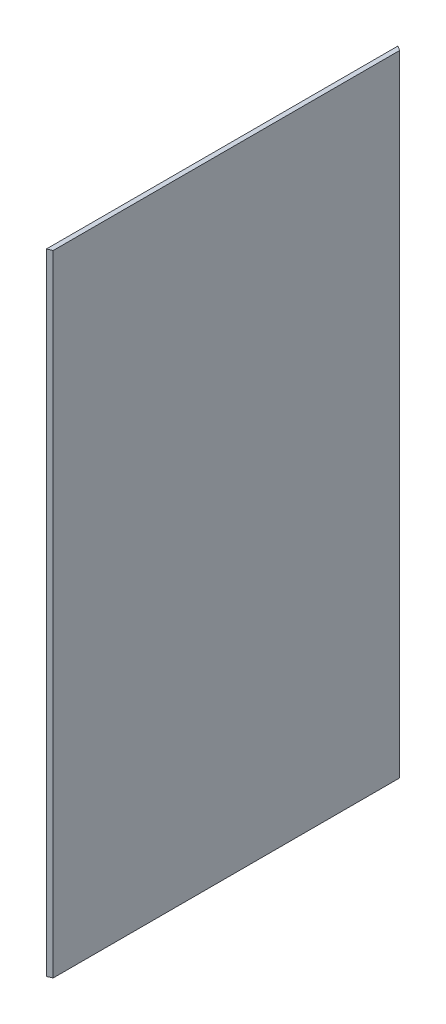
ISO-10303-21;
HEADER;
FILE_DESCRIPTION(('STEP AP214'),'2;1');
FILE_NAME('part.step','',(''),(''),'','','');
FILE_SCHEMA(('AUTOMOTIVE_DESIGN { 1 0 10303 214 1 1 1 1 }'));
ENDSEC;
DATA;
#1=APPLICATION_CONTEXT('core data for automotive mechanical design processes');
#2=APPLICATION_PROTOCOL_DEFINITION('international standard','automotive_design',2000,#1);
#3=PRODUCT_CONTEXT('',#1,'mechanical');
#4=PRODUCT('Part','Part','',(#3));
#5=PRODUCT_RELATED_PRODUCT_CATEGORY('part','',(#4));
#6=PRODUCT_DEFINITION_FORMATION('','',#4);
#7=PRODUCT_DEFINITION_CONTEXT('part definition',#1,'design');
#8=PRODUCT_DEFINITION('design','',#6,#7);
#9=PRODUCT_DEFINITION_SHAPE('','',#8);
#10=(LENGTH_UNIT() NAMED_UNIT(*) SI_UNIT(.MILLI.,.METRE.));
#11=(NAMED_UNIT(*) PLANE_ANGLE_UNIT() SI_UNIT($,.RADIAN.));
#12=(NAMED_UNIT(*) SI_UNIT($,.STERADIAN.) SOLID_ANGLE_UNIT());
#13=UNCERTAINTY_MEASURE_WITH_UNIT(LENGTH_MEASURE(1.E-05),#10,'distance_accuracy_value','');
#14=(GEOMETRIC_REPRESENTATION_CONTEXT(3) GLOBAL_UNCERTAINTY_ASSIGNED_CONTEXT((#13)) GLOBAL_UNIT_ASSIGNED_CONTEXT((#10,
#11,#12)) REPRESENTATION_CONTEXT('',''));
#15=CARTESIAN_POINT('',(0.,0.,0.));
#16=DIRECTION('',(0.,0.,1.));
#17=DIRECTION('',(1.,0.,0.));
#18=AXIS2_PLACEMENT_3D('',#15,#16,#17);
#19=CARTESIAN_POINT('',(0.,533.,0.));
#20=DIRECTION('',(1.,0.,0.));
#21=DIRECTION('',(0.,0.,-1.));
#22=AXIS2_PLACEMENT_3D('',#19,#20,#21);
#23=PLANE('',#22);
#24=DIRECTION('',(0.,0.,1.));
#25=VECTOR('',#24,1.);
#26=CARTESIAN_POINT('',(0.,0.,0.));
#27=LINE('',#26,#25);
#28=CARTESIAN_POINT('',(0.,0.,-297.387590837121));
#29=VERTEX_POINT('',#28);
#30=CARTESIAN_POINT('',(0.,0.,0.));
#31=VERTEX_POINT('',#30);
#32=EDGE_CURVE('E96',#29,#31,#27,.T.);
#33=ORIENTED_EDGE('',*,*,#32,.T.);
#34=DIRECTION('',(0.,-1.,0.));
#35=VECTOR('',#34,1.);
#36=CARTESIAN_POINT('',(0.,533.,0.));
#37=LINE('',#36,#35);
#38=CARTESIAN_POINT('',(0.,533.,0.));
#39=VERTEX_POINT('',#38);
#40=EDGE_CURVE('E11',#39,#31,#37,.T.);
#41=ORIENTED_EDGE('',*,*,#40,.F.);
#42=DIRECTION('',(0.,0.,1.));
#43=VECTOR('',#42,1.);
#44=CARTESIAN_POINT('',(0.,533.,0.));
#45=LINE('',#44,#43);
#46=CARTESIAN_POINT('',(0.,533.,-297.387590837121));
#47=VERTEX_POINT('',#46);
#48=EDGE_CURVE('E84',#47,#39,#45,.T.);
#49=ORIENTED_EDGE('',*,*,#48,.F.);
#50=DIRECTION('',(0.,-1.,0.));
#51=VECTOR('',#50,1.);
#52=CARTESIAN_POINT('',(0.,533.,-297.387590837121));
#53=LINE('',#52,#51);
#54=EDGE_CURVE('E92',#47,#29,#53,.T.);
#55=ORIENTED_EDGE('',*,*,#54,.T.);
#56=EDGE_LOOP('',(#33,#41,#49,#55));
#57=FACE_BOUND('',#56,.T.);
#58=ADVANCED_FACE('F33',(#57),#23,.F.);
#59=CARTESIAN_POINT('',(0.,533.,0.));
#60=DIRECTION('',(-0.403602443988454,0.,-0.914934460607178));
#61=DIRECTION('',(-0.914934460607178,0.,0.403602443988454));
#62=AXIS2_PLACEMENT_3D('',#59,#60,#61);
#63=PLANE('',#62);
#64=DIRECTION('',(0.914934460607178,0.,-0.403602443988454));
#65=VECTOR('',#64,1.);
#66=CARTESIAN_POINT('',(0.,0.,0.));
#67=LINE('',#66,#65);
#68=CARTESIAN_POINT('',(4.,0.,-1.76450865658994));
#69=VERTEX_POINT('',#68);
#70=EDGE_CURVE('E88',#31,#69,#67,.T.);
#71=ORIENTED_EDGE('',*,*,#70,.T.);
#72=DIRECTION('',(0.,-1.,0.));
#73=VECTOR('',#72,1.);
#74=CARTESIAN_POINT('',(4.,533.,-1.76450865658994));
#75=LINE('',#74,#73);
#76=CARTESIAN_POINT('',(4.,533.,-1.76450865658994));
#77=VERTEX_POINT('',#76);
#78=EDGE_CURVE('E41',#77,#69,#75,.T.);
#79=ORIENTED_EDGE('',*,*,#78,.F.);
#80=DIRECTION('',(0.914934460607178,0.,-0.403602443988454));
#81=VECTOR('',#80,1.);
#82=CARTESIAN_POINT('',(0.,533.,0.));
#83=LINE('',#82,#81);
#84=EDGE_CURVE('E79',#39,#77,#83,.T.);
#85=ORIENTED_EDGE('',*,*,#84,.F.);
#86=ORIENTED_EDGE('',*,*,#40,.T.);
#87=EDGE_LOOP('',(#71,#79,#85,#86));
#88=FACE_BOUND('',#87,.T.);
#89=ADVANCED_FACE('F87',(#88),#63,.F.);
#90=CARTESIAN_POINT('',(4.,533.,-1.76450865658994));
#91=DIRECTION('',(-1.,0.,0.));
#92=DIRECTION('',(0.,0.,1.));
#93=AXIS2_PLACEMENT_3D('',#90,#91,#92);
#94=PLANE('',#93);
#95=DIRECTION('',(0.,0.,-1.));
#96=VECTOR('',#95,1.);
#97=CARTESIAN_POINT('',(4.,0.,-1.76450865658994));
#98=LINE('',#97,#96);
#99=CARTESIAN_POINT('',(4.,0.,-294.827324918367));
#100=VERTEX_POINT('',#99);
#101=EDGE_CURVE('E66',#69,#100,#98,.T.);
#102=ORIENTED_EDGE('',*,*,#101,.T.);
#103=DIRECTION('',(0.,-1.,0.));
#104=VECTOR('',#103,1.);
#105=CARTESIAN_POINT('',(4.,533.,-294.827324918367));
#106=LINE('',#105,#104);
#107=CARTESIAN_POINT('',(4.,533.,-294.827324918367));
#108=VERTEX_POINT('',#107);
#109=EDGE_CURVE('E89',#108,#100,#106,.T.);
#110=ORIENTED_EDGE('',*,*,#109,.F.);
#111=DIRECTION('',(0.,0.,-1.));
#112=VECTOR('',#111,1.);
#113=CARTESIAN_POINT('',(4.,533.,-1.76450865658994));
#114=LINE('',#113,#112);
#115=EDGE_CURVE('E82',#77,#108,#114,.T.);
#116=ORIENTED_EDGE('',*,*,#115,.F.);
#117=ORIENTED_EDGE('',*,*,#78,.T.);
#118=EDGE_LOOP('',(#102,#110,#116,#117));
#119=FACE_BOUND('',#118,.T.);
#120=ADVANCED_FACE('F90',(#119),#94,.F.);
#121=CARTESIAN_POINT('',(0.,533.,-297.387590837121));
#122=DIRECTION('',(-0.539093417908417,0.,0.842245977590763));
#123=DIRECTION('',(0.842245977590763,0.,0.539093417908417));
#124=AXIS2_PLACEMENT_3D('',#121,#122,#123);
#125=PLANE('',#124);
#126=DIRECTION('',(-0.842245977590763,0.,-0.539093417908417));
#127=VECTOR('',#126,1.);
#128=CARTESIAN_POINT('',(0.,0.,-297.387590837121));
#129=LINE('',#128,#127);
#130=EDGE_CURVE('E72',#100,#29,#129,.T.);
#131=ORIENTED_EDGE('',*,*,#130,.T.);
#132=ORIENTED_EDGE('',*,*,#54,.F.);
#133=DIRECTION('',(-0.842245977590763,0.,-0.539093417908417));
#134=VECTOR('',#133,1.);
#135=CARTESIAN_POINT('',(0.,533.,-297.387590837121));
#136=LINE('',#135,#134);
#137=EDGE_CURVE('E49',#108,#47,#136,.T.);
#138=ORIENTED_EDGE('',*,*,#137,.F.);
#139=ORIENTED_EDGE('',*,*,#109,.T.);
#140=EDGE_LOOP('',(#131,#132,#138,#139));
#141=FACE_BOUND('',#140,.T.);
#142=ADVANCED_FACE('F103',(#141),#125,.F.);
#143=CARTESIAN_POINT('',(0.,533.,0.));
#144=DIRECTION('',(0.,-1.,0.));
#145=DIRECTION('',(0.,0.,-1.));
#146=AXIS2_PLACEMENT_3D('',#143,#144,#145);
#147=PLANE('',#146);
#148=ORIENTED_EDGE('',*,*,#48,.T.);
#149=ORIENTED_EDGE('',*,*,#84,.T.);
#150=ORIENTED_EDGE('',*,*,#115,.T.);
#151=ORIENTED_EDGE('',*,*,#137,.T.);
#152=EDGE_LOOP('',(#148,#149,#150,#151));
#153=FACE_BOUND('',#152,.T.);
#154=ADVANCED_FACE('F80',(#153),#147,.F.);
#155=CARTESIAN_POINT('',(0.,0.,0.));
#156=DIRECTION('',(0.,-1.,0.));
#157=DIRECTION('',(0.,0.,-1.));
#158=AXIS2_PLACEMENT_3D('',#155,#156,#157);
#159=PLANE('',#158);
#160=ORIENTED_EDGE('',*,*,#32,.F.);
#161=ORIENTED_EDGE('',*,*,#130,.F.);
#162=ORIENTED_EDGE('',*,*,#101,.F.);
#163=ORIENTED_EDGE('',*,*,#70,.F.);
#164=EDGE_LOOP('',(#160,#161,#162,#163));
#165=FACE_BOUND('',#164,.T.);
#166=ADVANCED_FACE('F106',(#165),#159,.T.);
#167=CLOSED_SHELL('',(#58,#89,#120,#142,#154,#166));
#168=MANIFOLD_SOLID_BREP('B2',#167);
#169=ADVANCED_BREP_SHAPE_REPRESENTATION('',(#18,#168),#14);
#170=SHAPE_DEFINITION_REPRESENTATION(#9,#169);
ENDSEC;
END-ISO-10303-21;
